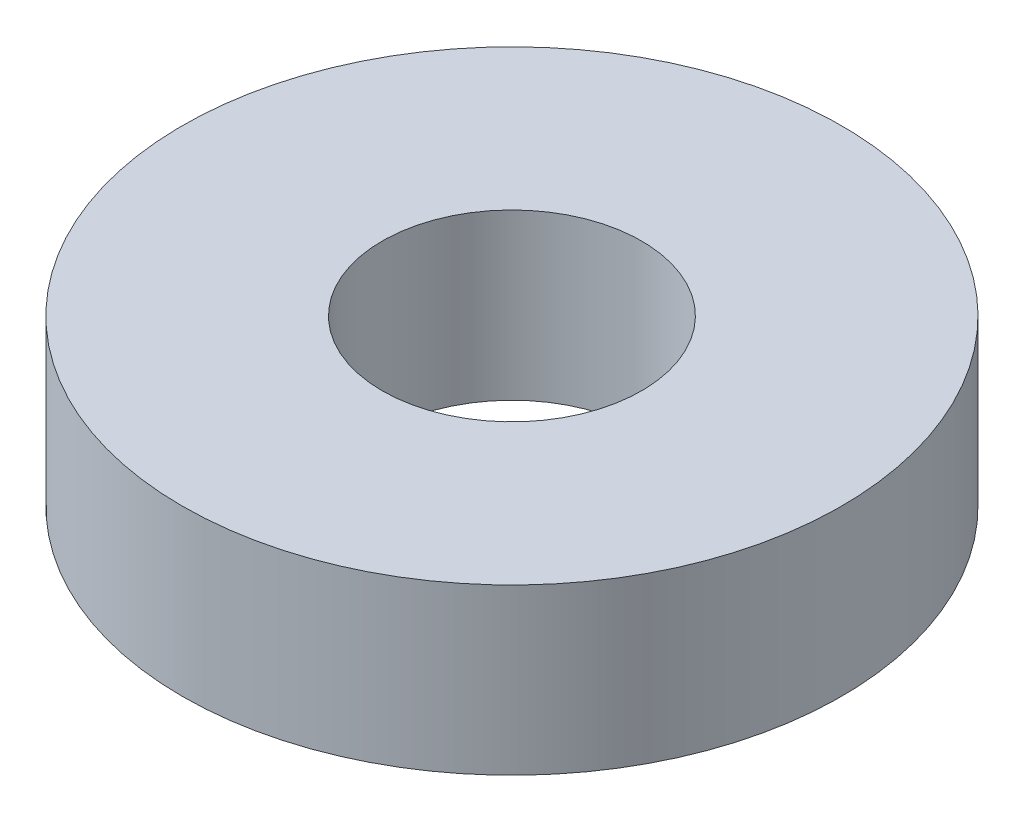
ISO-10303-21;
HEADER;
FILE_DESCRIPTION(('STEP AP214'),'2;1');
FILE_NAME('part.step','',(''),(''),'','','');
FILE_SCHEMA(('AUTOMOTIVE_DESIGN { 1 0 10303 214 1 1 1 1 }'));
ENDSEC;
DATA;
#1=APPLICATION_CONTEXT('core data for automotive mechanical design processes');
#2=APPLICATION_PROTOCOL_DEFINITION('international standard','automotive_design',2000,#1);
#3=PRODUCT_CONTEXT('',#1,'mechanical');
#4=PRODUCT('Part','Part','',(#3));
#5=PRODUCT_RELATED_PRODUCT_CATEGORY('part','',(#4));
#6=PRODUCT_DEFINITION_FORMATION('','',#4);
#7=PRODUCT_DEFINITION_CONTEXT('part definition',#1,'design');
#8=PRODUCT_DEFINITION('design','',#6,#7);
#9=PRODUCT_DEFINITION_SHAPE('','',#8);
#10=(LENGTH_UNIT() NAMED_UNIT(*) SI_UNIT(.MILLI.,.METRE.));
#11=(NAMED_UNIT(*) PLANE_ANGLE_UNIT() SI_UNIT($,.RADIAN.));
#12=(NAMED_UNIT(*) SI_UNIT($,.STERADIAN.) SOLID_ANGLE_UNIT());
#13=UNCERTAINTY_MEASURE_WITH_UNIT(LENGTH_MEASURE(1.E-05),#10,'distance_accuracy_value','');
#14=(GEOMETRIC_REPRESENTATION_CONTEXT(3) GLOBAL_UNCERTAINTY_ASSIGNED_CONTEXT((#13)) GLOBAL_UNIT_ASSIGNED_CONTEXT((#10,
#11,#12)) REPRESENTATION_CONTEXT('',''));
#15=CARTESIAN_POINT('',(0.,0.,0.));
#16=DIRECTION('',(0.,0.,1.));
#17=DIRECTION('',(1.,0.,0.));
#18=AXIS2_PLACEMENT_3D('',#15,#16,#17);
#19=CARTESIAN_POINT('',(0.,1.5875,0.));
#20=DIRECTION('',(0.,-1.,0.));
#21=DIRECTION('',(0.,0.,-1.));
#22=AXIS2_PLACEMENT_3D('',#19,#20,#21);
#23=CYLINDRICAL_SURFACE('',#22,6.35);
#24=CARTESIAN_POINT('',(0.,1.5875,0.));
#25=DIRECTION('',(0.,1.,0.));
#26=DIRECTION('',(0.,0.,1.));
#27=AXIS2_PLACEMENT_3D('',#24,#25,#26);
#28=CIRCLE('',#27,6.35);
#29=CARTESIAN_POINT('',(0.,1.5875,6.35));
#30=VERTEX_POINT('',#29);
#31=EDGE_CURVE('E10',#30,#30,#28,.T.);
#32=ORIENTED_EDGE('',*,*,#31,.F.);
#33=EDGE_LOOP('',(#32));
#34=FACE_BOUND('',#33,.T.);
#35=CARTESIAN_POINT('',(0.,-1.5875,0.));
#36=DIRECTION('',(0.,1.,0.));
#37=DIRECTION('',(0.,0.,1.));
#38=AXIS2_PLACEMENT_3D('',#35,#36,#37);
#39=CIRCLE('',#38,6.35);
#40=CARTESIAN_POINT('',(0.,-1.5875,6.35));
#41=VERTEX_POINT('',#40);
#42=EDGE_CURVE('E32',#41,#41,#39,.T.);
#43=ORIENTED_EDGE('',*,*,#42,.T.);
#44=EDGE_LOOP('',(#43));
#45=FACE_BOUND('',#44,.T.);
#46=ADVANCED_FACE('F29',(#34,#45),#23,.T.);
#47=CARTESIAN_POINT('',(0.,1.5875,0.));
#48=DIRECTION('',(0.,1.,0.));
#49=DIRECTION('',(0.,0.,1.));
#50=AXIS2_PLACEMENT_3D('',#47,#48,#49);
#51=PLANE('',#50);
#52=CARTESIAN_POINT('',(0.,1.5875,0.));
#53=DIRECTION('',(0.,1.,0.));
#54=DIRECTION('',(0.,0.,1.));
#55=AXIS2_PLACEMENT_3D('',#52,#53,#54);
#56=CIRCLE('',#55,2.5);
#57=CARTESIAN_POINT('',(0.,1.5875,2.5));
#58=VERTEX_POINT('',#57);
#59=EDGE_CURVE('E41',#58,#58,#56,.T.);
#60=ORIENTED_EDGE('',*,*,#59,.F.);
#61=EDGE_LOOP('',(#60));
#62=FACE_BOUND('',#61,.T.);
#63=ORIENTED_EDGE('',*,*,#31,.T.);
#64=EDGE_LOOP('',(#63));
#65=FACE_BOUND('',#64,.T.);
#66=ADVANCED_FACE('F56',(#62,#65),#51,.T.);
#67=CARTESIAN_POINT('',(0.,-1.5875,0.));
#68=DIRECTION('',(0.,1.,0.));
#69=DIRECTION('',(0.,0.,1.));
#70=AXIS2_PLACEMENT_3D('',#67,#68,#69);
#71=PLANE('',#70);
#72=CARTESIAN_POINT('',(0.,-1.5875,0.));
#73=DIRECTION('',(0.,1.,0.));
#74=DIRECTION('',(0.,0.,1.));
#75=AXIS2_PLACEMENT_3D('',#72,#73,#74);
#76=CIRCLE('',#75,2.5);
#77=CARTESIAN_POINT('',(0.,-1.5875,2.5));
#78=VERTEX_POINT('',#77);
#79=EDGE_CURVE('E39',#78,#78,#76,.T.);
#80=ORIENTED_EDGE('',*,*,#79,.T.);
#81=EDGE_LOOP('',(#80));
#82=FACE_BOUND('',#81,.T.);
#83=ORIENTED_EDGE('',*,*,#42,.F.);
#84=EDGE_LOOP('',(#83));
#85=FACE_BOUND('',#84,.T.);
#86=ADVANCED_FACE('F47',(#82,#85),#71,.F.);
#87=CARTESIAN_POINT('',(0.,-1.5875,0.));
#88=DIRECTION('',(0.,1.,0.));
#89=DIRECTION('',(0.,0.,1.));
#90=AXIS2_PLACEMENT_3D('',#87,#88,#89);
#91=CYLINDRICAL_SURFACE('',#90,2.5);
#92=ORIENTED_EDGE('',*,*,#79,.F.);
#93=EDGE_LOOP('',(#92));
#94=FACE_BOUND('',#93,.T.);
#95=ORIENTED_EDGE('',*,*,#59,.T.);
#96=EDGE_LOOP('',(#95));
#97=FACE_BOUND('',#96,.T.);
#98=ADVANCED_FACE('F50',(#94,#97),#91,.F.);
#99=CLOSED_SHELL('',(#46,#66,#86,#98));
#100=MANIFOLD_SOLID_BREP('B2',#99);
#101=ADVANCED_BREP_SHAPE_REPRESENTATION('',(#18,#100),#14);
#102=SHAPE_DEFINITION_REPRESENTATION(#9,#101);
ENDSEC;
END-ISO-10303-21;
